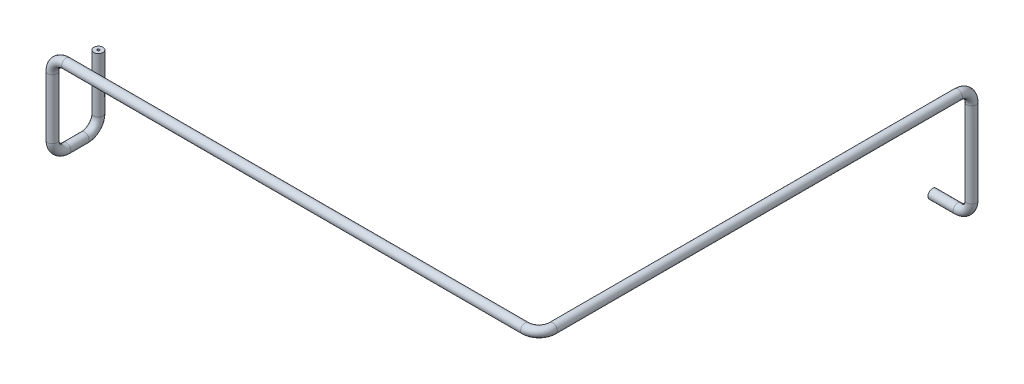
ISO-10303-21;
HEADER;
FILE_DESCRIPTION(('STEP AP214'),'2;1');
FILE_NAME('part.step','',(''),(''),'','','');
FILE_SCHEMA(('AUTOMOTIVE_DESIGN { 1 0 10303 214 1 1 1 1 }'));
ENDSEC;
DATA;
#1=APPLICATION_CONTEXT('core data for automotive mechanical design processes');
#2=APPLICATION_PROTOCOL_DEFINITION('international standard','automotive_design',2000,#1);
#3=PRODUCT_CONTEXT('',#1,'mechanical');
#4=PRODUCT('Part','Part','',(#3));
#5=PRODUCT_RELATED_PRODUCT_CATEGORY('part','',(#4));
#6=PRODUCT_DEFINITION_FORMATION('','',#4);
#7=PRODUCT_DEFINITION_CONTEXT('part definition',#1,'design');
#8=PRODUCT_DEFINITION('design','',#6,#7);
#9=PRODUCT_DEFINITION_SHAPE('','',#8);
#10=(LENGTH_UNIT() NAMED_UNIT(*) SI_UNIT(.MILLI.,.METRE.));
#11=(NAMED_UNIT(*) PLANE_ANGLE_UNIT() SI_UNIT($,.RADIAN.));
#12=(NAMED_UNIT(*) SI_UNIT($,.STERADIAN.) SOLID_ANGLE_UNIT());
#13=UNCERTAINTY_MEASURE_WITH_UNIT(LENGTH_MEASURE(1.E-05),#10,'distance_accuracy_value','');
#14=(GEOMETRIC_REPRESENTATION_CONTEXT(3) GLOBAL_UNCERTAINTY_ASSIGNED_CONTEXT((#13)) GLOBAL_UNIT_ASSIGNED_CONTEXT((#10,
#11,#12)) REPRESENTATION_CONTEXT('',''));
#15=CARTESIAN_POINT('',(0.,0.,0.));
#16=DIRECTION('',(0.,0.,1.));
#17=DIRECTION('',(1.,0.,0.));
#18=AXIS2_PLACEMENT_3D('',#15,#16,#17);
#19=CARTESIAN_POINT('',(-20.,402.,236.));
#20=DIRECTION('',(0.,1.,0.));
#21=DIRECTION('',(-1.,0.,0.));
#22=AXIS2_PLACEMENT_3D('',#19,#20,#21);
#23=PLANE('',#22);
#24=CARTESIAN_POINT('',(-20.,402.,236.));
#25=DIRECTION('',(0.,1.,0.));
#26=DIRECTION('',(-1.,0.,0.));
#27=AXIS2_PLACEMENT_3D('',#24,#25,#26);
#28=CIRCLE('',#27,0.5);
#29=CARTESIAN_POINT('',(-20.5,402.,236.));
#30=VERTEX_POINT('',#29);
#31=EDGE_CURVE('E412',#30,#30,#28,.T.);
#32=ORIENTED_EDGE('',*,*,#31,.F.);
#33=EDGE_LOOP('',(#32));
#34=FACE_BOUND('',#33,.T.);
#35=CARTESIAN_POINT('',(-20.,402.,236.));
#36=DIRECTION('',(0.,1.,0.));
#37=DIRECTION('',(0.,0.,1.));
#38=AXIS2_PLACEMENT_3D('',#35,#36,#37);
#39=CIRCLE('',#38,2.);
#40=CARTESIAN_POINT('',(-20.,402.,238.));
#41=VERTEX_POINT('',#40);
#42=EDGE_CURVE('E75',#41,#41,#39,.T.);
#43=ORIENTED_EDGE('',*,*,#42,.T.);
#44=EDGE_LOOP('',(#43));
#45=FACE_BOUND('',#44,.T.);
#46=ADVANCED_FACE('F52',(#34,#45),#23,.T.);
#47=CARTESIAN_POINT('',(175.,361.,67.5));
#48=DIRECTION('',(1.,0.,0.));
#49=DIRECTION('',(0.,0.,-1.));
#50=AXIS2_PLACEMENT_3D('',#47,#48,#49);
#51=PLANE('',#50);
#52=CARTESIAN_POINT('',(175.,361.,67.5));
#53=DIRECTION('',(1.,0.,0.));
#54=DIRECTION('',(0.,0.,-1.));
#55=AXIS2_PLACEMENT_3D('',#52,#53,#54);
#56=CIRCLE('',#55,0.5);
#57=CARTESIAN_POINT('',(175.,361.,67.));
#58=VERTEX_POINT('',#57);
#59=EDGE_CURVE('E73',#58,#58,#56,.T.);
#60=ORIENTED_EDGE('',*,*,#59,.T.);
#61=EDGE_LOOP('',(#60));
#62=FACE_BOUND('',#61,.T.);
#63=CARTESIAN_POINT('',(175.,361.,67.5));
#64=DIRECTION('',(1.,0.,0.));
#65=DIRECTION('',(0.,0.,-1.));
#66=AXIS2_PLACEMENT_3D('',#63,#64,#65);
#67=CIRCLE('',#66,2.);
#68=CARTESIAN_POINT('',(175.,361.,65.5));
#69=VERTEX_POINT('',#68);
#70=EDGE_CURVE('E11',#69,#69,#67,.T.);
#71=ORIENTED_EDGE('',*,*,#70,.F.);
#72=EDGE_LOOP('',(#71));
#73=FACE_BOUND('',#72,.T.);
#74=ADVANCED_FACE('F191',(#62,#73),#51,.F.);
#75=CARTESIAN_POINT('',(-20.,402.,236.));
#76=DIRECTION('',(0.,-1.,0.));
#77=DIRECTION('',(0.,0.,-1.));
#78=AXIS2_PLACEMENT_3D('',#75,#76,#77);
#79=CYLINDRICAL_SURFACE('',#78,2.);
#80=CARTESIAN_POINT('',(-20.,378.,236.));
#81=DIRECTION('',(0.,-1.,0.));
#82=DIRECTION('',(0.,0.,-1.));
#83=AXIS2_PLACEMENT_3D('',#80,#81,#82);
#84=CIRCLE('',#83,2.);
#85=CARTESIAN_POINT('',(-20.,378.,234.));
#86=VERTEX_POINT('',#85);
#87=EDGE_CURVE('E74',#86,#86,#84,.F.);
#88=ORIENTED_EDGE('',*,*,#87,.T.);
#89=EDGE_LOOP('',(#88));
#90=FACE_BOUND('',#89,.T.);
#91=ORIENTED_EDGE('',*,*,#42,.F.);
#92=EDGE_LOOP('',(#91));
#93=FACE_BOUND('',#92,.T.);
#94=ADVANCED_FACE('F193',(#90,#93),#79,.T.);
#95=CARTESIAN_POINT('',(-20.,378.,242.));
#96=DIRECTION('',(-1.,0.,0.));
#97=DIRECTION('',(0.,0.,1.));
#98=AXIS2_PLACEMENT_3D('',#95,#96,#97);
#99=TOROIDAL_SURFACE('',#98,6.00000000000001,2.);
#100=CARTESIAN_POINT('',(-20.,372.,242.));
#101=DIRECTION('',(0.,0.,-1.));
#102=DIRECTION('',(0.,1.,0.));
#103=AXIS2_PLACEMENT_3D('',#100,#101,#102);
#104=CIRCLE('',#103,2.);
#105=CARTESIAN_POINT('',(-20.,370.,242.));
#106=VERTEX_POINT('',#105);
#107=EDGE_CURVE('E78',#106,#106,#104,.T.);
#108=CARTESIAN_POINT('',(-20.,378.,242.));
#109=DIRECTION('',(-1.,0.,0.));
#110=DIRECTION('',(0.,0.,1.));
#111=AXIS2_PLACEMENT_3D('',#108,#109,#110);
#112=CIRCLE('',#111,8.00000000000001);
#113=EDGE_CURVE('',#86,#106,#112,.T.);
#114=ORIENTED_EDGE('',*,*,#87,.F.);
#115=ORIENTED_EDGE('',*,*,#107,.T.);
#116=ORIENTED_EDGE('',*,*,#113,.T.);
#117=ORIENTED_EDGE('',*,*,#113,.F.);
#118=EDGE_LOOP('',(#114,#116,#115,#117));
#119=FACE_BOUND('',#118,.T.);
#120=ADVANCED_FACE('F199',(#119),#99,.T.);
#121=CARTESIAN_POINT('',(-20.,372.,242.));
#122=DIRECTION('',(0.,0.,1.));
#123=DIRECTION('',(1.,0.,0.));
#124=AXIS2_PLACEMENT_3D('',#121,#122,#123);
#125=CYLINDRICAL_SURFACE('',#124,2.);
#126=CARTESIAN_POINT('',(-20.,372.,250.));
#127=DIRECTION('',(0.,0.,1.));
#128=DIRECTION('',(1.,0.,0.));
#129=AXIS2_PLACEMENT_3D('',#126,#127,#128);
#130=CIRCLE('',#129,2.);
#131=CARTESIAN_POINT('',(-20.,370.,250.));
#132=VERTEX_POINT('',#131);
#133=EDGE_CURVE('E91',#132,#132,#130,.F.);
#134=ORIENTED_EDGE('',*,*,#133,.T.);
#135=EDGE_LOOP('',(#134));
#136=FACE_BOUND('',#135,.T.);
#137=ORIENTED_EDGE('',*,*,#107,.F.);
#138=EDGE_LOOP('',(#137));
#139=FACE_BOUND('',#138,.T.);
#140=ADVANCED_FACE('F204',(#136,#139),#125,.T.);
#141=CARTESIAN_POINT('',(-20.,378.,250.));
#142=DIRECTION('',(-1.,0.,0.));
#143=DIRECTION('',(0.,0.,1.));
#144=AXIS2_PLACEMENT_3D('',#141,#142,#143);
#145=TOROIDAL_SURFACE('',#144,6.00000000000001,2.);
#146=CARTESIAN_POINT('',(-20.,378.,256.));
#147=DIRECTION('',(0.,-1.,0.));
#148=DIRECTION('',(0.,0.,-1.));
#149=AXIS2_PLACEMENT_3D('',#146,#147,#148);
#150=CIRCLE('',#149,2.);
#151=CARTESIAN_POINT('',(-20.,378.,258.));
#152=VERTEX_POINT('',#151);
#153=EDGE_CURVE('E96',#152,#152,#150,.T.);
#154=CARTESIAN_POINT('',(-20.,378.,250.));
#155=DIRECTION('',(-1.,0.,0.));
#156=DIRECTION('',(0.,0.,1.));
#157=AXIS2_PLACEMENT_3D('',#154,#155,#156);
#158=CIRCLE('',#157,8.00000000000001);
#159=EDGE_CURVE('',#132,#152,#158,.T.);
#160=ORIENTED_EDGE('',*,*,#133,.F.);
#161=ORIENTED_EDGE('',*,*,#153,.T.);
#162=ORIENTED_EDGE('',*,*,#159,.T.);
#163=ORIENTED_EDGE('',*,*,#159,.F.);
#164=EDGE_LOOP('',(#160,#162,#161,#163));
#165=FACE_BOUND('',#164,.T.);
#166=ADVANCED_FACE('F208',(#165),#145,.T.);
#167=CARTESIAN_POINT('',(-20.,378.,256.));
#168=DIRECTION('',(0.,1.,0.));
#169=DIRECTION('',(0.,0.,1.));
#170=AXIS2_PLACEMENT_3D('',#167,#168,#169);
#171=CYLINDRICAL_SURFACE('',#170,2.);
#172=CARTESIAN_POINT('',(-20.,404.,256.));
#173=DIRECTION('',(0.,1.,0.));
#174=DIRECTION('',(0.,0.,1.));
#175=AXIS2_PLACEMENT_3D('',#172,#173,#174);
#176=CIRCLE('',#175,2.);
#177=CARTESIAN_POINT('',(-22.,404.,256.));
#178=VERTEX_POINT('',#177);
#179=EDGE_CURVE('E97',#178,#178,#176,.F.);
#180=ORIENTED_EDGE('',*,*,#179,.T.);
#181=EDGE_LOOP('',(#180));
#182=FACE_BOUND('',#181,.T.);
#183=ORIENTED_EDGE('',*,*,#153,.F.);
#184=EDGE_LOOP('',(#183));
#185=FACE_BOUND('',#184,.T.);
#186=ADVANCED_FACE('F215',(#182,#185),#171,.T.);
#187=CARTESIAN_POINT('',(-14.,404.,256.));
#188=DIRECTION('',(0.,0.,-1.));
#189=DIRECTION('',(-1.,0.,0.));
#190=AXIS2_PLACEMENT_3D('',#187,#188,#189);
#191=TOROIDAL_SURFACE('',#190,6.,2.);
#192=CARTESIAN_POINT('',(-14.,410.,256.));
#193=DIRECTION('',(-1.,0.,0.));
#194=DIRECTION('',(0.,-1.,0.));
#195=AXIS2_PLACEMENT_3D('',#192,#193,#194);
#196=CIRCLE('',#195,2.);
#197=CARTESIAN_POINT('',(-14.,412.,256.));
#198=VERTEX_POINT('',#197);
#199=EDGE_CURVE('E105',#198,#198,#196,.T.);
#200=CARTESIAN_POINT('',(-14.,404.,256.));
#201=DIRECTION('',(0.,0.,-1.));
#202=DIRECTION('',(-1.,0.,0.));
#203=AXIS2_PLACEMENT_3D('',#200,#201,#202);
#204=CIRCLE('',#203,8.);
#205=EDGE_CURVE('',#178,#198,#204,.T.);
#206=ORIENTED_EDGE('',*,*,#179,.F.);
#207=ORIENTED_EDGE('',*,*,#199,.T.);
#208=ORIENTED_EDGE('',*,*,#205,.T.);
#209=ORIENTED_EDGE('',*,*,#205,.F.);
#210=EDGE_LOOP('',(#206,#208,#207,#209));
#211=FACE_BOUND('',#210,.T.);
#212=ADVANCED_FACE('F216',(#211),#191,.T.);
#213=CARTESIAN_POINT('',(-14.,410.,256.));
#214=DIRECTION('',(1.,0.,0.));
#215=DIRECTION('',(0.,0.,-1.));
#216=AXIS2_PLACEMENT_3D('',#213,#214,#215);
#217=CYLINDRICAL_SURFACE('',#216,2.);
#218=CARTESIAN_POINT('',(186.,410.,256.));
#219=DIRECTION('',(1.,0.,0.));
#220=DIRECTION('',(0.,0.,-1.));
#221=AXIS2_PLACEMENT_3D('',#218,#219,#220);
#222=CIRCLE('',#221,2.);
#223=CARTESIAN_POINT('',(186.,410.,258.));
#224=VERTEX_POINT('',#223);
#225=EDGE_CURVE('E104',#224,#224,#222,.F.);
#226=ORIENTED_EDGE('',*,*,#225,.T.);
#227=EDGE_LOOP('',(#226));
#228=FACE_BOUND('',#227,.T.);
#229=ORIENTED_EDGE('',*,*,#199,.F.);
#230=EDGE_LOOP('',(#229));
#231=FACE_BOUND('',#230,.T.);
#232=ADVANCED_FACE('F219',(#228,#231),#217,.T.);
#233=CARTESIAN_POINT('',(186.,410.,250.));
#234=DIRECTION('',(0.,1.,0.));
#235=DIRECTION('',(0.,0.,1.));
#236=AXIS2_PLACEMENT_3D('',#233,#234,#235);
#237=TOROIDAL_SURFACE('',#236,6.00000000000001,2.);
#238=CARTESIAN_POINT('',(192.,410.,250.));
#239=DIRECTION('',(0.,0.,1.));
#240=DIRECTION('',(1.,0.,0.));
#241=AXIS2_PLACEMENT_3D('',#238,#239,#240);
#242=CIRCLE('',#241,2.);
#243=CARTESIAN_POINT('',(194.,410.,250.));
#244=VERTEX_POINT('',#243);
#245=EDGE_CURVE('E107',#244,#244,#242,.T.);
#246=CARTESIAN_POINT('',(186.,410.,250.));
#247=DIRECTION('',(0.,1.,0.));
#248=DIRECTION('',(0.,0.,1.));
#249=AXIS2_PLACEMENT_3D('',#246,#247,#248);
#250=CIRCLE('',#249,8.00000000000001);
#251=EDGE_CURVE('',#224,#244,#250,.T.);
#252=ORIENTED_EDGE('',*,*,#225,.F.);
#253=ORIENTED_EDGE('',*,*,#245,.T.);
#254=ORIENTED_EDGE('',*,*,#251,.T.);
#255=ORIENTED_EDGE('',*,*,#251,.F.);
#256=EDGE_LOOP('',(#252,#254,#253,#255));
#257=FACE_BOUND('',#256,.T.);
#258=ADVANCED_FACE('F221',(#257),#237,.T.);
#259=CARTESIAN_POINT('',(192.,410.,250.));
#260=DIRECTION('',(0.,0.,-1.));
#261=DIRECTION('',(-1.,0.,0.));
#262=AXIS2_PLACEMENT_3D('',#259,#260,#261);
#263=CYLINDRICAL_SURFACE('',#262,2.);
#264=CARTESIAN_POINT('',(192.,410.,73.5));
#265=DIRECTION('',(0.,0.,-1.));
#266=DIRECTION('',(-1.,0.,0.));
#267=AXIS2_PLACEMENT_3D('',#264,#265,#266);
#268=CIRCLE('',#267,2.);
#269=CARTESIAN_POINT('',(192.,412.,73.5));
#270=VERTEX_POINT('',#269);
#271=EDGE_CURVE('E112',#270,#270,#268,.F.);
#272=ORIENTED_EDGE('',*,*,#271,.T.);
#273=EDGE_LOOP('',(#272));
#274=FACE_BOUND('',#273,.T.);
#275=ORIENTED_EDGE('',*,*,#245,.F.);
#276=EDGE_LOOP('',(#275));
#277=FACE_BOUND('',#276,.T.);
#278=ADVANCED_FACE('F126',(#274,#277),#263,.T.);
#279=CARTESIAN_POINT('',(192.,404.,73.5));
#280=DIRECTION('',(-1.,0.,0.));
#281=DIRECTION('',(0.,0.,1.));
#282=AXIS2_PLACEMENT_3D('',#279,#280,#281);
#283=TOROIDAL_SURFACE('',#282,6.00000000000001,2.);
#284=CARTESIAN_POINT('',(192.,404.,67.5));
#285=DIRECTION('',(0.,1.,0.));
#286=DIRECTION('',(0.,0.,1.));
#287=AXIS2_PLACEMENT_3D('',#284,#285,#286);
#288=CIRCLE('',#287,2.);
#289=CARTESIAN_POINT('',(192.,404.,65.5));
#290=VERTEX_POINT('',#289);
#291=EDGE_CURVE('E68',#290,#290,#288,.T.);
#292=CARTESIAN_POINT('',(192.,404.,73.5));
#293=DIRECTION('',(-1.,0.,0.));
#294=DIRECTION('',(0.,0.,1.));
#295=AXIS2_PLACEMENT_3D('',#292,#293,#294);
#296=CIRCLE('',#295,8.00000000000001);
#297=EDGE_CURVE('',#270,#290,#296,.T.);
#298=ORIENTED_EDGE('',*,*,#271,.F.);
#299=ORIENTED_EDGE('',*,*,#291,.T.);
#300=ORIENTED_EDGE('',*,*,#297,.T.);
#301=ORIENTED_EDGE('',*,*,#297,.F.);
#302=EDGE_LOOP('',(#298,#300,#299,#301));
#303=FACE_BOUND('',#302,.T.);
#304=ADVANCED_FACE('F119',(#303),#283,.T.);
#305=CARTESIAN_POINT('',(192.,404.,67.5));
#306=DIRECTION('',(0.,-1.,0.));
#307=DIRECTION('',(0.,0.,-1.));
#308=AXIS2_PLACEMENT_3D('',#305,#306,#307);
#309=CYLINDRICAL_SURFACE('',#308,2.);
#310=CARTESIAN_POINT('',(192.,367.,67.5));
#311=DIRECTION('',(0.,-1.,0.));
#312=DIRECTION('',(0.,0.,-1.));
#313=AXIS2_PLACEMENT_3D('',#310,#311,#312);
#314=CIRCLE('',#313,2.);
#315=CARTESIAN_POINT('',(194.,367.,67.5));
#316=VERTEX_POINT('',#315);
#317=EDGE_CURVE('E63',#316,#316,#314,.F.);
#318=ORIENTED_EDGE('',*,*,#317,.T.);
#319=EDGE_LOOP('',(#318));
#320=FACE_BOUND('',#319,.T.);
#321=ORIENTED_EDGE('',*,*,#291,.F.);
#322=EDGE_LOOP('',(#321));
#323=FACE_BOUND('',#322,.T.);
#324=ADVANCED_FACE('F118',(#320,#323),#309,.T.);
#325=CARTESIAN_POINT('',(186.,367.,67.5));
#326=DIRECTION('',(0.,0.,-1.));
#327=DIRECTION('',(-1.,0.,0.));
#328=AXIS2_PLACEMENT_3D('',#325,#326,#327);
#329=TOROIDAL_SURFACE('',#328,5.99999999999995,2.);
#330=CARTESIAN_POINT('',(186.,361.,67.5));
#331=DIRECTION('',(1.,0.,0.));
#332=DIRECTION('',(0.,1.,0.));
#333=AXIS2_PLACEMENT_3D('',#330,#331,#332);
#334=CIRCLE('',#333,2.);
#335=CARTESIAN_POINT('',(186.,359.,67.5));
#336=VERTEX_POINT('',#335);
#337=EDGE_CURVE('E58',#336,#336,#334,.T.);
#338=CARTESIAN_POINT('',(186.,367.,67.5));
#339=DIRECTION('',(0.,0.,-1.));
#340=DIRECTION('',(-1.,0.,0.));
#341=AXIS2_PLACEMENT_3D('',#338,#339,#340);
#342=CIRCLE('',#341,7.99999999999995);
#343=EDGE_CURVE('',#316,#336,#342,.T.);
#344=ORIENTED_EDGE('',*,*,#317,.F.);
#345=ORIENTED_EDGE('',*,*,#337,.T.);
#346=ORIENTED_EDGE('',*,*,#343,.T.);
#347=ORIENTED_EDGE('',*,*,#343,.F.);
#348=EDGE_LOOP('',(#344,#346,#345,#347));
#349=FACE_BOUND('',#348,.T.);
#350=ADVANCED_FACE('F121',(#349),#329,.T.);
#351=CARTESIAN_POINT('',(186.,361.,67.5));
#352=DIRECTION('',(-1.,0.,0.));
#353=DIRECTION('',(0.,0.,1.));
#354=AXIS2_PLACEMENT_3D('',#351,#352,#353);
#355=CYLINDRICAL_SURFACE('',#354,2.);
#356=ORIENTED_EDGE('',*,*,#70,.T.);
#357=EDGE_LOOP('',(#356));
#358=FACE_BOUND('',#357,.T.);
#359=ORIENTED_EDGE('',*,*,#337,.F.);
#360=EDGE_LOOP('',(#359));
#361=FACE_BOUND('',#360,.T.);
#362=ADVANCED_FACE('F54',(#358,#361),#355,.T.);
#363=CARTESIAN_POINT('',(-20.,402.,236.));
#364=DIRECTION('',(0.,-1.,0.));
#365=DIRECTION('',(0.,0.,-1.));
#366=AXIS2_PLACEMENT_3D('',#363,#364,#365);
#367=CYLINDRICAL_SURFACE('',#366,0.5);
#368=CARTESIAN_POINT('',(-20.,378.,236.));
#369=DIRECTION('',(0.,1.,0.));
#370=DIRECTION('',(-1.,0.,0.));
#371=AXIS2_PLACEMENT_3D('',#368,#369,#370);
#372=CIRCLE('',#371,0.5);
#373=CARTESIAN_POINT('',(-20.,378.,235.5));
#374=VERTEX_POINT('',#373);
#375=EDGE_CURVE('E413',#374,#374,#372,.T.);
#376=ORIENTED_EDGE('',*,*,#375,.F.);
#377=EDGE_LOOP('',(#376));
#378=FACE_BOUND('',#377,.T.);
#379=ORIENTED_EDGE('',*,*,#31,.T.);
#380=EDGE_LOOP('',(#379));
#381=FACE_BOUND('',#380,.T.);
#382=ADVANCED_FACE('F134',(#378,#381),#367,.F.);
#383=CARTESIAN_POINT('',(-20.,378.,242.));
#384=DIRECTION('',(-1.,0.,0.));
#385=DIRECTION('',(0.,0.,1.));
#386=AXIS2_PLACEMENT_3D('',#383,#384,#385);
#387=TOROIDAL_SURFACE('',#386,6.00000000000001,0.5);
#388=CARTESIAN_POINT('',(-20.,372.,242.));
#389=DIRECTION('',(0.,0.,-1.));
#390=DIRECTION('',(-1.,0.,0.));
#391=AXIS2_PLACEMENT_3D('',#388,#389,#390);
#392=CIRCLE('',#391,0.5);
#393=CARTESIAN_POINT('',(-20.,371.5,242.));
#394=VERTEX_POINT('',#393);
#395=EDGE_CURVE('E417',#394,#394,#392,.T.);
#396=CARTESIAN_POINT('',(-20.,378.,242.));
#397=DIRECTION('',(-1.,0.,0.));
#398=DIRECTION('',(0.,0.,1.));
#399=AXIS2_PLACEMENT_3D('',#396,#397,#398);
#400=CIRCLE('',#399,6.50000000000001);
#401=EDGE_CURVE('',#374,#394,#400,.T.);
#402=ORIENTED_EDGE('',*,*,#375,.T.);
#403=ORIENTED_EDGE('',*,*,#395,.F.);
#404=ORIENTED_EDGE('',*,*,#401,.T.);
#405=ORIENTED_EDGE('',*,*,#401,.F.);
#406=EDGE_LOOP('',(#402,#404,#403,#405));
#407=FACE_BOUND('',#406,.T.);
#408=ADVANCED_FACE('F132',(#407),#387,.F.);
#409=CARTESIAN_POINT('',(-20.,372.,242.));
#410=DIRECTION('',(0.,0.,1.));
#411=DIRECTION('',(1.,0.,0.));
#412=AXIS2_PLACEMENT_3D('',#409,#410,#411);
#413=CYLINDRICAL_SURFACE('',#412,0.5);
#414=CARTESIAN_POINT('',(-20.,372.,250.));
#415=DIRECTION('',(0.,0.,-1.));
#416=DIRECTION('',(-1.,0.,0.));
#417=AXIS2_PLACEMENT_3D('',#414,#415,#416);
#418=CIRCLE('',#417,0.5);
#419=CARTESIAN_POINT('',(-20.,371.5,250.));
#420=VERTEX_POINT('',#419);
#421=EDGE_CURVE('E425',#420,#420,#418,.T.);
#422=ORIENTED_EDGE('',*,*,#421,.F.);
#423=EDGE_LOOP('',(#422));
#424=FACE_BOUND('',#423,.T.);
#425=ORIENTED_EDGE('',*,*,#395,.T.);
#426=EDGE_LOOP('',(#425));
#427=FACE_BOUND('',#426,.T.);
#428=ADVANCED_FACE('F142',(#424,#427),#413,.F.);
#429=CARTESIAN_POINT('',(-20.,378.,250.));
#430=DIRECTION('',(-1.,0.,0.));
#431=DIRECTION('',(0.,0.,1.));
#432=AXIS2_PLACEMENT_3D('',#429,#430,#431);
#433=TOROIDAL_SURFACE('',#432,6.00000000000001,0.5);
#434=CARTESIAN_POINT('',(-20.,378.,256.));
#435=DIRECTION('',(0.,-1.,0.));
#436=DIRECTION('',(-1.,0.,0.));
#437=AXIS2_PLACEMENT_3D('',#434,#435,#436);
#438=CIRCLE('',#437,0.5);
#439=CARTESIAN_POINT('',(-20.,378.,256.5));
#440=VERTEX_POINT('',#439);
#441=EDGE_CURVE('E422',#440,#440,#438,.T.);
#442=CARTESIAN_POINT('',(-20.,378.,250.));
#443=DIRECTION('',(-1.,0.,0.));
#444=DIRECTION('',(0.,0.,1.));
#445=AXIS2_PLACEMENT_3D('',#442,#443,#444);
#446=CIRCLE('',#445,6.50000000000001);
#447=EDGE_CURVE('',#420,#440,#446,.T.);
#448=ORIENTED_EDGE('',*,*,#421,.T.);
#449=ORIENTED_EDGE('',*,*,#441,.F.);
#450=ORIENTED_EDGE('',*,*,#447,.T.);
#451=ORIENTED_EDGE('',*,*,#447,.F.);
#452=EDGE_LOOP('',(#448,#450,#449,#451));
#453=FACE_BOUND('',#452,.T.);
#454=ADVANCED_FACE('F147',(#453),#433,.F.);
#455=CARTESIAN_POINT('',(-20.,378.,256.));
#456=DIRECTION('',(0.,1.,0.));
#457=DIRECTION('',(0.,0.,1.));
#458=AXIS2_PLACEMENT_3D('',#455,#456,#457);
#459=CYLINDRICAL_SURFACE('',#458,0.5);
#460=CARTESIAN_POINT('',(-20.,404.,256.));
#461=DIRECTION('',(0.,-1.,0.));
#462=DIRECTION('',(-1.,0.,0.));
#463=AXIS2_PLACEMENT_3D('',#460,#461,#462);
#464=CIRCLE('',#463,0.5);
#465=CARTESIAN_POINT('',(-20.5,404.,256.));
#466=VERTEX_POINT('',#465);
#467=EDGE_CURVE('E428',#466,#466,#464,.T.);
#468=ORIENTED_EDGE('',*,*,#467,.F.);
#469=EDGE_LOOP('',(#468));
#470=FACE_BOUND('',#469,.T.);
#471=ORIENTED_EDGE('',*,*,#441,.T.);
#472=EDGE_LOOP('',(#471));
#473=FACE_BOUND('',#472,.T.);
#474=ADVANCED_FACE('F152',(#470,#473),#459,.F.);
#475=CARTESIAN_POINT('',(-14.,404.,256.));
#476=DIRECTION('',(0.,0.,-1.));
#477=DIRECTION('',(-1.,0.,0.));
#478=AXIS2_PLACEMENT_3D('',#475,#476,#477);
#479=TOROIDAL_SURFACE('',#478,6.,0.5);
#480=CARTESIAN_POINT('',(-14.,410.,256.));
#481=DIRECTION('',(-1.,0.,0.));
#482=DIRECTION('',(0.,1.,0.));
#483=AXIS2_PLACEMENT_3D('',#480,#481,#482);
#484=CIRCLE('',#483,0.5);
#485=CARTESIAN_POINT('',(-14.,410.5,256.));
#486=VERTEX_POINT('',#485);
#487=EDGE_CURVE('E431',#486,#486,#484,.T.);
#488=CARTESIAN_POINT('',(-14.,404.,256.));
#489=DIRECTION('',(0.,0.,-1.));
#490=DIRECTION('',(-1.,0.,0.));
#491=AXIS2_PLACEMENT_3D('',#488,#489,#490);
#492=CIRCLE('',#491,6.5);
#493=EDGE_CURVE('',#466,#486,#492,.T.);
#494=ORIENTED_EDGE('',*,*,#467,.T.);
#495=ORIENTED_EDGE('',*,*,#487,.F.);
#496=ORIENTED_EDGE('',*,*,#493,.T.);
#497=ORIENTED_EDGE('',*,*,#493,.F.);
#498=EDGE_LOOP('',(#494,#496,#495,#497));
#499=FACE_BOUND('',#498,.T.);
#500=ADVANCED_FACE('F158',(#499),#479,.F.);
#501=CARTESIAN_POINT('',(-14.,410.,256.));
#502=DIRECTION('',(1.,0.,0.));
#503=DIRECTION('',(0.,0.,-1.));
#504=AXIS2_PLACEMENT_3D('',#501,#502,#503);
#505=CYLINDRICAL_SURFACE('',#504,0.5);
#506=CARTESIAN_POINT('',(186.,410.,256.));
#507=DIRECTION('',(-1.,0.,0.));
#508=DIRECTION('',(0.,1.,0.));
#509=AXIS2_PLACEMENT_3D('',#506,#507,#508);
#510=CIRCLE('',#509,0.5);
#511=CARTESIAN_POINT('',(186.,410.,256.5));
#512=VERTEX_POINT('',#511);
#513=EDGE_CURVE('E432',#512,#512,#510,.T.);
#514=ORIENTED_EDGE('',*,*,#513,.F.);
#515=EDGE_LOOP('',(#514));
#516=FACE_BOUND('',#515,.T.);
#517=ORIENTED_EDGE('',*,*,#487,.T.);
#518=EDGE_LOOP('',(#517));
#519=FACE_BOUND('',#518,.T.);
#520=ADVANCED_FACE('F165',(#516,#519),#505,.F.);
#521=CARTESIAN_POINT('',(186.,410.,250.));
#522=DIRECTION('',(0.,1.,0.));
#523=DIRECTION('',(0.,0.,1.));
#524=AXIS2_PLACEMENT_3D('',#521,#522,#523);
#525=TOROIDAL_SURFACE('',#524,6.00000000000001,0.5);
#526=CARTESIAN_POINT('',(192.,410.,250.));
#527=DIRECTION('',(0.,0.,1.));
#528=DIRECTION('',(0.,1.,0.));
#529=AXIS2_PLACEMENT_3D('',#526,#527,#528);
#530=CIRCLE('',#529,0.5);
#531=CARTESIAN_POINT('',(192.5,410.,250.));
#532=VERTEX_POINT('',#531);
#533=EDGE_CURVE('E440',#532,#532,#530,.T.);
#534=CARTESIAN_POINT('',(186.,410.,250.));
#535=DIRECTION('',(0.,1.,0.));
#536=DIRECTION('',(0.,0.,1.));
#537=AXIS2_PLACEMENT_3D('',#534,#535,#536);
#538=CIRCLE('',#537,6.50000000000001);
#539=EDGE_CURVE('',#512,#532,#538,.T.);
#540=ORIENTED_EDGE('',*,*,#513,.T.);
#541=ORIENTED_EDGE('',*,*,#533,.F.);
#542=ORIENTED_EDGE('',*,*,#539,.T.);
#543=ORIENTED_EDGE('',*,*,#539,.F.);
#544=EDGE_LOOP('',(#540,#542,#541,#543));
#545=FACE_BOUND('',#544,.T.);
#546=ADVANCED_FACE('F167',(#545),#525,.F.);
#547=CARTESIAN_POINT('',(192.,410.,250.));
#548=DIRECTION('',(0.,0.,-1.));
#549=DIRECTION('',(-1.,0.,0.));
#550=AXIS2_PLACEMENT_3D('',#547,#548,#549);
#551=CYLINDRICAL_SURFACE('',#550,0.5);
#552=CARTESIAN_POINT('',(192.,410.,73.5));
#553=DIRECTION('',(0.,0.,1.));
#554=DIRECTION('',(0.,1.,0.));
#555=AXIS2_PLACEMENT_3D('',#552,#553,#554);
#556=CIRCLE('',#555,0.5);
#557=CARTESIAN_POINT('',(192.,410.5,73.5));
#558=VERTEX_POINT('',#557);
#559=EDGE_CURVE('E439',#558,#558,#556,.T.);
#560=ORIENTED_EDGE('',*,*,#559,.F.);
#561=EDGE_LOOP('',(#560));
#562=FACE_BOUND('',#561,.T.);
#563=ORIENTED_EDGE('',*,*,#533,.T.);
#564=EDGE_LOOP('',(#563));
#565=FACE_BOUND('',#564,.T.);
#566=ADVANCED_FACE('F168',(#562,#565),#551,.F.);
#567=CARTESIAN_POINT('',(192.,404.,73.5));
#568=DIRECTION('',(-1.,0.,0.));
#569=DIRECTION('',(0.,0.,1.));
#570=AXIS2_PLACEMENT_3D('',#567,#568,#569);
#571=TOROIDAL_SURFACE('',#570,6.00000000000001,0.5);
#572=CARTESIAN_POINT('',(192.,404.,67.5));
#573=DIRECTION('',(0.,1.,0.));
#574=DIRECTION('',(0.,0.,-1.));
#575=AXIS2_PLACEMENT_3D('',#572,#573,#574);
#576=CIRCLE('',#575,0.5);
#577=CARTESIAN_POINT('',(192.,404.,67.));
#578=VERTEX_POINT('',#577);
#579=EDGE_CURVE('E444',#578,#578,#576,.T.);
#580=CARTESIAN_POINT('',(192.,404.,73.5));
#581=DIRECTION('',(-1.,0.,0.));
#582=DIRECTION('',(0.,0.,1.));
#583=AXIS2_PLACEMENT_3D('',#580,#581,#582);
#584=CIRCLE('',#583,6.50000000000001);
#585=EDGE_CURVE('',#558,#578,#584,.T.);
#586=ORIENTED_EDGE('',*,*,#559,.T.);
#587=ORIENTED_EDGE('',*,*,#579,.F.);
#588=ORIENTED_EDGE('',*,*,#585,.T.);
#589=ORIENTED_EDGE('',*,*,#585,.F.);
#590=EDGE_LOOP('',(#586,#588,#587,#589));
#591=FACE_BOUND('',#590,.T.);
#592=ADVANCED_FACE('F173',(#591),#571,.F.);
#593=CARTESIAN_POINT('',(192.,404.,67.5));
#594=DIRECTION('',(0.,-1.,0.));
#595=DIRECTION('',(0.,0.,-1.));
#596=AXIS2_PLACEMENT_3D('',#593,#594,#595);
#597=CYLINDRICAL_SURFACE('',#596,0.5);
#598=CARTESIAN_POINT('',(192.,367.,67.5));
#599=DIRECTION('',(0.,1.,0.));
#600=DIRECTION('',(0.,0.,-1.));
#601=AXIS2_PLACEMENT_3D('',#598,#599,#600);
#602=CIRCLE('',#601,0.5);
#603=CARTESIAN_POINT('',(192.5,367.,67.5));
#604=VERTEX_POINT('',#603);
#605=EDGE_CURVE('E87',#604,#604,#602,.T.);
#606=ORIENTED_EDGE('',*,*,#605,.F.);
#607=EDGE_LOOP('',(#606));
#608=FACE_BOUND('',#607,.T.);
#609=ORIENTED_EDGE('',*,*,#579,.T.);
#610=EDGE_LOOP('',(#609));
#611=FACE_BOUND('',#610,.T.);
#612=ADVANCED_FACE('F177',(#608,#611),#597,.F.);
#613=CARTESIAN_POINT('',(186.,367.,67.5));
#614=DIRECTION('',(0.,0.,-1.));
#615=DIRECTION('',(-1.,0.,0.));
#616=AXIS2_PLACEMENT_3D('',#613,#614,#615);
#617=TOROIDAL_SURFACE('',#616,5.99999999999995,0.5);
#618=CARTESIAN_POINT('',(186.,361.,67.5));
#619=DIRECTION('',(1.,0.,0.));
#620=DIRECTION('',(0.,0.,-1.));
#621=AXIS2_PLACEMENT_3D('',#618,#619,#620);
#622=CIRCLE('',#621,0.5);
#623=CARTESIAN_POINT('',(186.,360.5,67.5));
#624=VERTEX_POINT('',#623);
#625=EDGE_CURVE('E85',#624,#624,#622,.T.);
#626=CARTESIAN_POINT('',(186.,367.,67.5));
#627=DIRECTION('',(0.,0.,-1.));
#628=DIRECTION('',(-1.,0.,0.));
#629=AXIS2_PLACEMENT_3D('',#626,#627,#628);
#630=CIRCLE('',#629,6.49999999999995);
#631=EDGE_CURVE('',#604,#624,#630,.T.);
#632=ORIENTED_EDGE('',*,*,#605,.T.);
#633=ORIENTED_EDGE('',*,*,#625,.F.);
#634=ORIENTED_EDGE('',*,*,#631,.T.);
#635=ORIENTED_EDGE('',*,*,#631,.F.);
#636=EDGE_LOOP('',(#632,#634,#633,#635));
#637=FACE_BOUND('',#636,.T.);
#638=ADVANCED_FACE('F185',(#637),#617,.F.);
#639=CARTESIAN_POINT('',(186.,361.,67.5));
#640=DIRECTION('',(-1.,0.,0.));
#641=DIRECTION('',(0.,0.,1.));
#642=AXIS2_PLACEMENT_3D('',#639,#640,#641);
#643=CYLINDRICAL_SURFACE('',#642,0.5);
#644=ORIENTED_EDGE('',*,*,#59,.F.);
#645=EDGE_LOOP('',(#644));
#646=FACE_BOUND('',#645,.T.);
#647=ORIENTED_EDGE('',*,*,#625,.T.);
#648=EDGE_LOOP('',(#647));
#649=FACE_BOUND('',#648,.T.);
#650=ADVANCED_FACE('F189',(#646,#649),#643,.F.);
#651=CLOSED_SHELL('',(#46,#74,#94,#120,#140,#166,#186,#212,#232,#258,#278,#304,#324,#350,#362,
#382,#408,#428,#454,#474,#500,#520,#546,#566,#592,#612,#638,#650));
#652=MANIFOLD_SOLID_BREP('B2',#651);
#653=ADVANCED_BREP_SHAPE_REPRESENTATION('',(#18,#652),#14);
#654=SHAPE_DEFINITION_REPRESENTATION(#9,#653);
ENDSEC;
END-ISO-10303-21;
